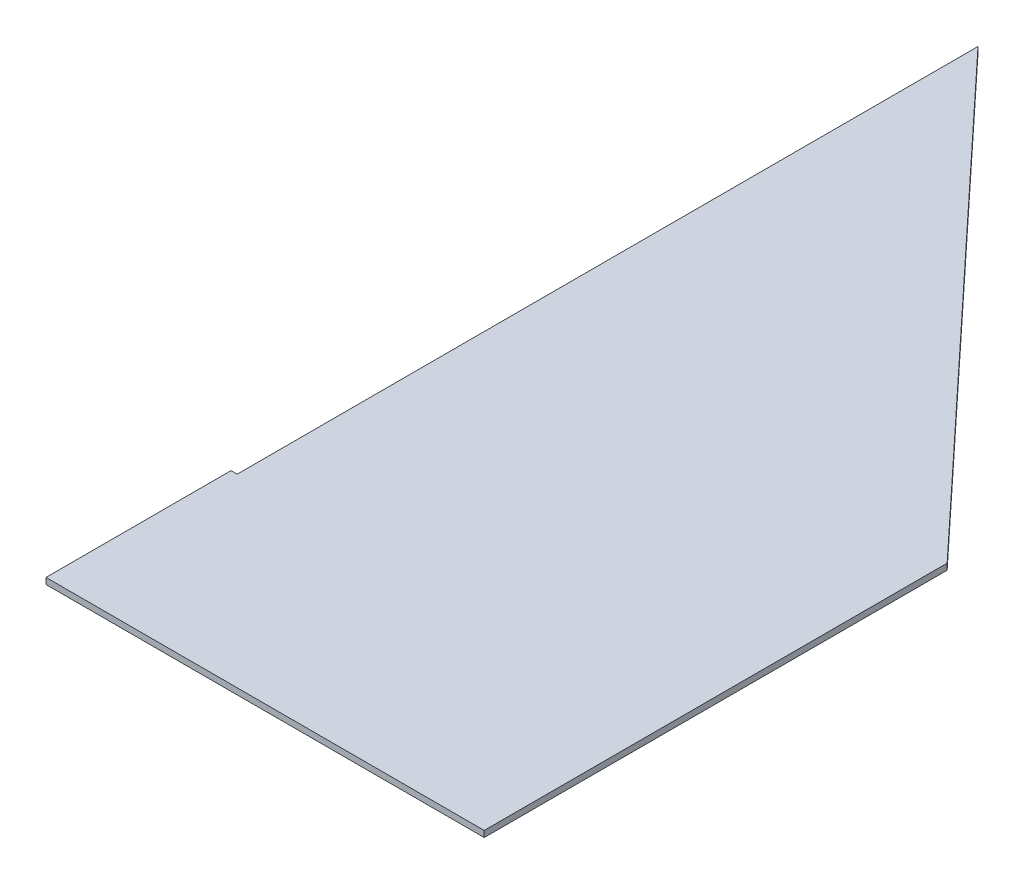
ISO-10303-21;
HEADER;
FILE_DESCRIPTION(('STEP AP214'),'2;1');
FILE_NAME('part.step','',(''),(''),'','','');
FILE_SCHEMA(('AUTOMOTIVE_DESIGN { 1 0 10303 214 1 1 1 1 }'));
ENDSEC;
DATA;
#1=APPLICATION_CONTEXT('core data for automotive mechanical design processes');
#2=APPLICATION_PROTOCOL_DEFINITION('international standard','automotive_design',2000,#1);
#3=PRODUCT_CONTEXT('',#1,'mechanical');
#4=PRODUCT('Part','Part','',(#3));
#5=PRODUCT_RELATED_PRODUCT_CATEGORY('part','',(#4));
#6=PRODUCT_DEFINITION_FORMATION('','',#4);
#7=PRODUCT_DEFINITION_CONTEXT('part definition',#1,'design');
#8=PRODUCT_DEFINITION('design','',#6,#7);
#9=PRODUCT_DEFINITION_SHAPE('','',#8);
#10=(LENGTH_UNIT() NAMED_UNIT(*) SI_UNIT(.MILLI.,.METRE.));
#11=(NAMED_UNIT(*) PLANE_ANGLE_UNIT() SI_UNIT($,.RADIAN.));
#12=(NAMED_UNIT(*) SI_UNIT($,.STERADIAN.) SOLID_ANGLE_UNIT());
#13=UNCERTAINTY_MEASURE_WITH_UNIT(LENGTH_MEASURE(1.E-05),#10,'distance_accuracy_value','');
#14=(GEOMETRIC_REPRESENTATION_CONTEXT(3) GLOBAL_UNCERTAINTY_ASSIGNED_CONTEXT((#13)) GLOBAL_UNIT_ASSIGNED_CONTEXT((#10,
#11,#12)) REPRESENTATION_CONTEXT('',''));
#15=CARTESIAN_POINT('',(0.,0.,0.));
#16=DIRECTION('',(0.,0.,1.));
#17=DIRECTION('',(1.,0.,0.));
#18=AXIS2_PLACEMENT_3D('',#15,#16,#17);
#19=CARTESIAN_POINT('',(140.,2.,-150.));
#20=DIRECTION('',(-0.731055268242869,0.,0.682318250360011));
#21=DIRECTION('',(0.682318250360011,0.,0.731055268242869));
#22=AXIS2_PLACEMENT_3D('',#19,#20,#21);
#23=PLANE('',#22);
#24=DIRECTION('',(-0.682318250360011,0.,-0.731055268242869));
#25=VECTOR('',#24,1.);
#26=CARTESIAN_POINT('',(140.,0.,-150.));
#27=LINE('',#26,#25);
#28=CARTESIAN_POINT('',(140.,0.,-150.));
#29=VERTEX_POINT('',#28);
#30=CARTESIAN_POINT('',(0.,0.,-300.));
#31=VERTEX_POINT('',#30);
#32=EDGE_CURVE('E117',#29,#31,#27,.T.);
#33=ORIENTED_EDGE('',*,*,#32,.T.);
#34=DIRECTION('',(0.,-1.,0.));
#35=VECTOR('',#34,1.);
#36=CARTESIAN_POINT('',(0.,2.,-300.));
#37=LINE('',#36,#35);
#38=CARTESIAN_POINT('',(0.,2.,-300.));
#39=VERTEX_POINT('',#38);
#40=EDGE_CURVE('E11',#39,#31,#37,.T.);
#41=ORIENTED_EDGE('',*,*,#40,.F.);
#42=DIRECTION('',(-0.682318250360011,0.,-0.731055268242869));
#43=VECTOR('',#42,1.);
#44=CARTESIAN_POINT('',(140.,2.,-150.));
#45=LINE('',#44,#43);
#46=CARTESIAN_POINT('',(140.,2.,-150.));
#47=VERTEX_POINT('',#46);
#48=EDGE_CURVE('E127',#47,#39,#45,.T.);
#49=ORIENTED_EDGE('',*,*,#48,.F.);
#50=DIRECTION('',(0.,-1.,0.));
#51=VECTOR('',#50,1.);
#52=CARTESIAN_POINT('',(140.,2.,-150.));
#53=LINE('',#52,#51);
#54=EDGE_CURVE('E113',#47,#29,#53,.T.);
#55=ORIENTED_EDGE('',*,*,#54,.T.);
#56=EDGE_LOOP('',(#33,#41,#49,#55));
#57=FACE_BOUND('',#56,.T.);
#58=ADVANCED_FACE('F33',(#57),#23,.F.);
#59=CARTESIAN_POINT('',(0.,2.,-300.));
#60=DIRECTION('',(1.,0.,0.));
#61=DIRECTION('',(0.,0.,-1.));
#62=AXIS2_PLACEMENT_3D('',#59,#60,#61);
#63=PLANE('',#62);
#64=DIRECTION('',(0.,0.,1.));
#65=VECTOR('',#64,1.);
#66=CARTESIAN_POINT('',(0.,0.,-300.));
#67=LINE('',#66,#65);
#68=CARTESIAN_POINT('',(-5.55111512312578E-13,0.,-59.93));
#69=VERTEX_POINT('',#68);
#70=EDGE_CURVE('E120',#31,#69,#67,.T.);
#71=ORIENTED_EDGE('',*,*,#70,.T.);
#72=DIRECTION('',(0.,-1.,0.));
#73=VECTOR('',#72,1.);
#74=CARTESIAN_POINT('',(-5.55111512312578E-13,2.,-59.93));
#75=LINE('',#74,#73);
#76=CARTESIAN_POINT('',(-5.55111512312578E-13,2.,-59.93));
#77=VERTEX_POINT('',#76);
#78=EDGE_CURVE('E41',#77,#69,#75,.T.);
#79=ORIENTED_EDGE('',*,*,#78,.F.);
#80=DIRECTION('',(0.,0.,1.));
#81=VECTOR('',#80,1.);
#82=CARTESIAN_POINT('',(0.,2.,-300.));
#83=LINE('',#82,#81);
#84=EDGE_CURVE('E85',#39,#77,#83,.T.);
#85=ORIENTED_EDGE('',*,*,#84,.F.);
#86=ORIENTED_EDGE('',*,*,#40,.T.);
#87=EDGE_LOOP('',(#71,#79,#85,#86));
#88=FACE_BOUND('',#87,.T.);
#89=ADVANCED_FACE('F151',(#88),#63,.F.);
#90=CARTESIAN_POINT('',(-2.,2.,-59.93));
#91=DIRECTION('',(0.,0.,1.));
#92=DIRECTION('',(1.,0.,0.));
#93=AXIS2_PLACEMENT_3D('',#90,#91,#92);
#94=PLANE('',#93);
#95=DIRECTION('',(-1.,0.,0.));
#96=VECTOR('',#95,1.);
#97=CARTESIAN_POINT('',(-2.,0.,-59.93));
#98=LINE('',#97,#96);
#99=CARTESIAN_POINT('',(-2.,0.,-59.93));
#100=VERTEX_POINT('',#99);
#101=EDGE_CURVE('E122',#69,#100,#98,.T.);
#102=ORIENTED_EDGE('',*,*,#101,.T.);
#103=DIRECTION('',(0.,-1.,0.));
#104=VECTOR('',#103,1.);
#105=CARTESIAN_POINT('',(-2.,2.,-59.93));
#106=LINE('',#105,#104);
#107=CARTESIAN_POINT('',(-2.,2.,-59.93));
#108=VERTEX_POINT('',#107);
#109=EDGE_CURVE('E108',#108,#100,#106,.T.);
#110=ORIENTED_EDGE('',*,*,#109,.F.);
#111=DIRECTION('',(-1.,0.,0.));
#112=VECTOR('',#111,1.);
#113=CARTESIAN_POINT('',(-2.,2.,-59.93));
#114=LINE('',#113,#112);
#115=EDGE_CURVE('E98',#77,#108,#114,.T.);
#116=ORIENTED_EDGE('',*,*,#115,.F.);
#117=ORIENTED_EDGE('',*,*,#78,.T.);
#118=EDGE_LOOP('',(#102,#110,#116,#117));
#119=FACE_BOUND('',#118,.T.);
#120=ADVANCED_FACE('F133',(#119),#94,.F.);
#121=CARTESIAN_POINT('',(-2.,2.,0.));
#122=DIRECTION('',(1.,0.,0.));
#123=DIRECTION('',(0.,0.,-1.));
#124=AXIS2_PLACEMENT_3D('',#121,#122,#123);
#125=PLANE('',#124);
#126=DIRECTION('',(0.,0.,1.));
#127=VECTOR('',#126,1.);
#128=CARTESIAN_POINT('',(-2.,0.,0.));
#129=LINE('',#128,#127);
#130=CARTESIAN_POINT('',(-2.,0.,0.));
#131=VERTEX_POINT('',#130);
#132=EDGE_CURVE('E107',#100,#131,#129,.T.);
#133=ORIENTED_EDGE('',*,*,#132,.T.);
#134=DIRECTION('',(0.,-1.,0.));
#135=VECTOR('',#134,1.);
#136=CARTESIAN_POINT('',(-2.,2.,0.));
#137=LINE('',#136,#135);
#138=CARTESIAN_POINT('',(-2.,2.,0.));
#139=VERTEX_POINT('',#138);
#140=EDGE_CURVE('E104',#139,#131,#137,.T.);
#141=ORIENTED_EDGE('',*,*,#140,.F.);
#142=DIRECTION('',(0.,0.,1.));
#143=VECTOR('',#142,1.);
#144=CARTESIAN_POINT('',(-2.,2.,0.));
#145=LINE('',#144,#143);
#146=EDGE_CURVE('E92',#108,#139,#145,.T.);
#147=ORIENTED_EDGE('',*,*,#146,.F.);
#148=ORIENTED_EDGE('',*,*,#109,.T.);
#149=EDGE_LOOP('',(#133,#141,#147,#148));
#150=FACE_BOUND('',#149,.T.);
#151=ADVANCED_FACE('F105',(#150),#125,.F.);
#152=CARTESIAN_POINT('',(0.,2.,0.));
#153=DIRECTION('',(0.,0.,-1.));
#154=DIRECTION('',(-1.,0.,0.));
#155=AXIS2_PLACEMENT_3D('',#152,#153,#154);
#156=PLANE('',#155);
#157=DIRECTION('',(1.,0.,0.));
#158=VECTOR('',#157,1.);
#159=CARTESIAN_POINT('',(0.,0.,0.));
#160=LINE('',#159,#158);
#161=CARTESIAN_POINT('',(140.,0.,0.));
#162=VERTEX_POINT('',#161);
#163=EDGE_CURVE('E71',#131,#162,#160,.T.);
#164=ORIENTED_EDGE('',*,*,#163,.T.);
#165=DIRECTION('',(0.,-1.,0.));
#166=VECTOR('',#165,1.);
#167=CARTESIAN_POINT('',(140.,2.,0.));
#168=LINE('',#167,#166);
#169=CARTESIAN_POINT('',(140.,2.,0.));
#170=VERTEX_POINT('',#169);
#171=EDGE_CURVE('E109',#170,#162,#168,.T.);
#172=ORIENTED_EDGE('',*,*,#171,.F.);
#173=DIRECTION('',(1.,0.,0.));
#174=VECTOR('',#173,1.);
#175=CARTESIAN_POINT('',(0.,2.,0.));
#176=LINE('',#175,#174);
#177=EDGE_CURVE('E96',#139,#170,#176,.T.);
#178=ORIENTED_EDGE('',*,*,#177,.F.);
#179=ORIENTED_EDGE('',*,*,#140,.T.);
#180=EDGE_LOOP('',(#164,#172,#178,#179));
#181=FACE_BOUND('',#180,.T.);
#182=ADVANCED_FACE('F111',(#181),#156,.F.);
#183=CARTESIAN_POINT('',(140.,2.,0.));
#184=DIRECTION('',(-1.,0.,0.));
#185=DIRECTION('',(0.,0.,1.));
#186=AXIS2_PLACEMENT_3D('',#183,#184,#185);
#187=PLANE('',#186);
#188=DIRECTION('',(0.,0.,-1.));
#189=VECTOR('',#188,1.);
#190=CARTESIAN_POINT('',(140.,0.,0.));
#191=LINE('',#190,#189);
#192=EDGE_CURVE('E77',#162,#29,#191,.T.);
#193=ORIENTED_EDGE('',*,*,#192,.T.);
#194=ORIENTED_EDGE('',*,*,#54,.F.);
#195=DIRECTION('',(0.,0.,-1.));
#196=VECTOR('',#195,1.);
#197=CARTESIAN_POINT('',(140.,2.,0.));
#198=LINE('',#197,#196);
#199=EDGE_CURVE('E49',#170,#47,#198,.T.);
#200=ORIENTED_EDGE('',*,*,#199,.F.);
#201=ORIENTED_EDGE('',*,*,#171,.T.);
#202=EDGE_LOOP('',(#193,#194,#200,#201));
#203=FACE_BOUND('',#202,.T.);
#204=ADVANCED_FACE('F140',(#203),#187,.F.);
#205=CARTESIAN_POINT('',(0.,2.,0.));
#206=DIRECTION('',(0.,-1.,0.));
#207=DIRECTION('',(0.,0.,-1.));
#208=AXIS2_PLACEMENT_3D('',#205,#206,#207);
#209=PLANE('',#208);
#210=ORIENTED_EDGE('',*,*,#48,.T.);
#211=ORIENTED_EDGE('',*,*,#84,.T.);
#212=ORIENTED_EDGE('',*,*,#115,.T.);
#213=ORIENTED_EDGE('',*,*,#146,.T.);
#214=ORIENTED_EDGE('',*,*,#177,.T.);
#215=ORIENTED_EDGE('',*,*,#199,.T.);
#216=EDGE_LOOP('',(#210,#211,#212,#213,#214,#215));
#217=FACE_BOUND('',#216,.T.);
#218=ADVANCED_FACE('F94',(#217),#209,.F.);
#219=CARTESIAN_POINT('',(0.,0.,0.));
#220=DIRECTION('',(0.,-1.,0.));
#221=DIRECTION('',(0.,0.,-1.));
#222=AXIS2_PLACEMENT_3D('',#219,#220,#221);
#223=PLANE('',#222);
#224=ORIENTED_EDGE('',*,*,#32,.F.);
#225=ORIENTED_EDGE('',*,*,#192,.F.);
#226=ORIENTED_EDGE('',*,*,#163,.F.);
#227=ORIENTED_EDGE('',*,*,#132,.F.);
#228=ORIENTED_EDGE('',*,*,#101,.F.);
#229=ORIENTED_EDGE('',*,*,#70,.F.);
#230=EDGE_LOOP('',(#224,#225,#226,#227,#228,#229));
#231=FACE_BOUND('',#230,.T.);
#232=ADVANCED_FACE('F136',(#231),#223,.T.);
#233=CLOSED_SHELL('',(#58,#89,#120,#151,#182,#204,#218,#232));
#234=MANIFOLD_SOLID_BREP('B2',#233);
#235=ADVANCED_BREP_SHAPE_REPRESENTATION('',(#18,#234),#14);
#236=SHAPE_DEFINITION_REPRESENTATION(#9,#235);
ENDSEC;
END-ISO-10303-21;
